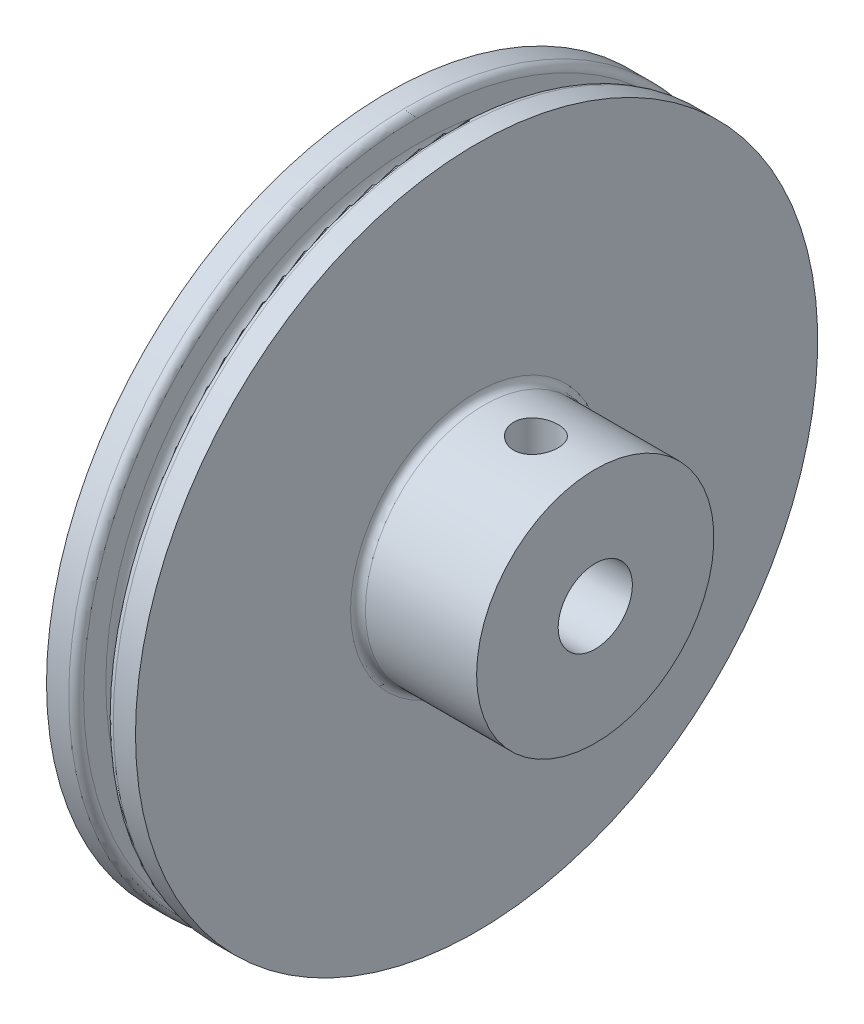
ISO-10303-21;
HEADER;
FILE_DESCRIPTION(('STEP AP214'),'2;1');
FILE_NAME('part.step','',(''),(''),'','','');
FILE_SCHEMA(('AUTOMOTIVE_DESIGN { 1 0 10303 214 1 1 1 1 }'));
ENDSEC;
DATA;
#1=APPLICATION_CONTEXT('core data for automotive mechanical design processes');
#2=APPLICATION_PROTOCOL_DEFINITION('international standard','automotive_design',2000,#1);
#3=PRODUCT_CONTEXT('',#1,'mechanical');
#4=PRODUCT('Part','Part','',(#3));
#5=PRODUCT_RELATED_PRODUCT_CATEGORY('part','',(#4));
#6=PRODUCT_DEFINITION_FORMATION('','',#4);
#7=PRODUCT_DEFINITION_CONTEXT('part definition',#1,'design');
#8=PRODUCT_DEFINITION('design','',#6,#7);
#9=PRODUCT_DEFINITION_SHAPE('','',#8);
#10=(LENGTH_UNIT() NAMED_UNIT(*) SI_UNIT(.MILLI.,.METRE.));
#11=(NAMED_UNIT(*) PLANE_ANGLE_UNIT() SI_UNIT($,.RADIAN.));
#12=(NAMED_UNIT(*) SI_UNIT($,.STERADIAN.) SOLID_ANGLE_UNIT());
#13=UNCERTAINTY_MEASURE_WITH_UNIT(LENGTH_MEASURE(1.E-05),#10,'distance_accuracy_value','');
#14=(GEOMETRIC_REPRESENTATION_CONTEXT(3) GLOBAL_UNCERTAINTY_ASSIGNED_CONTEXT((#13)) GLOBAL_UNIT_ASSIGNED_CONTEXT((#10,
#11,#12)) REPRESENTATION_CONTEXT('',''));
#15=CARTESIAN_POINT('',(0.,0.,0.));
#16=DIRECTION('',(0.,0.,1.));
#17=DIRECTION('',(1.,0.,0.));
#18=AXIS2_PLACEMENT_3D('',#15,#16,#17);
#19=CARTESIAN_POINT('',(-11.5426807899439,-7.97709760738326,0.));
#20=DIRECTION('',(-1.,0.,0.));
#21=DIRECTION('',(0.,0.,1.));
#22=AXIS2_PLACEMENT_3D('',#19,#20,#21);
#23=CYLINDRICAL_SURFACE('',#22,8.);
#24=CARTESIAN_POINT('',(2.45731921005608,-7.97709760738326,0.));
#25=DIRECTION('',(-1.,0.,0.));
#26=DIRECTION('',(0.,0.,1.));
#27=AXIS2_PLACEMENT_3D('',#24,#25,#26);
#28=CIRCLE('',#27,8.);
#29=CARTESIAN_POINT('',(2.45731921005608,-7.97709760738326,8.));
#30=VERTEX_POINT('',#29);
#31=EDGE_CURVE('E73',#30,#30,#28,.T.);
#32=ORIENTED_EDGE('',*,*,#31,.T.);
#33=EDGE_LOOP('',(#32));
#34=FACE_BOUND('',#33,.T.);
#35=CARTESIAN_POINT('',(-5.04268078994391,-7.97709760738326,0.));
#36=DIRECTION('',(-1.,0.,0.));
#37=DIRECTION('',(0.,0.,1.));
#38=AXIS2_PLACEMENT_3D('',#35,#36,#37);
#39=CIRCLE('',#38,8.);
#40=CARTESIAN_POINT('',(-5.04268078994391,-7.97709760738326,8.));
#41=VERTEX_POINT('',#40);
#42=EDGE_CURVE('E70',#41,#41,#39,.T.);
#43=ORIENTED_EDGE('',*,*,#42,.F.);
#44=EDGE_LOOP('',(#43));
#45=FACE_BOUND('',#44,.T.);
#46=CARTESIAN_POINT('',(-1.54268078994392,-0.1189807846324,-1.5));
#47=CARTESIAN_POINT('',(-1.62613799795566,-0.118979169448321,-1.49999679883246));
#48=CARTESIAN_POINT('',(-1.70963673816231,-0.117636809780593,-1.49301126348936));
#49=CARTESIAN_POINT('',(-1.87427975152583,-0.112419097239615,-1.46527253251805));
#50=CARTESIAN_POINT('',(-1.9554219663714,-0.108541595651204,-1.44450765768477));
#51=CARTESIAN_POINT('',(-2.11294586131479,-0.0987078427344111,-1.38987035617788));
#52=CARTESIAN_POINT('',(-2.18933189925121,-0.0927535283232876,-1.35601013954374));
#53=CARTESIAN_POINT('',(-2.33533434923073,-0.0794393441736656,-1.27617565760366));
#54=CARTESIAN_POINT('',(-2.40495128894722,-0.0720795841270393,-1.23020233759193));
#55=CARTESIAN_POINT('',(-2.53631098914305,-0.0566814589938103,-1.12683678942622));
#56=CARTESIAN_POINT('',(-2.59795727341565,-0.0486364411264648,-1.06932292933092));
#57=CARTESIAN_POINT('',(-2.71078517954348,-0.0328330307429168,-0.944771778803551));
#58=CARTESIAN_POINT('',(-2.76196611436871,-0.025074657071728,-0.877733863624944));
#59=CARTESIAN_POINT('',(-2.85278016654443,-0.010647429099206,-0.735403894570162));
#60=CARTESIAN_POINT('',(-2.89232232346334,-0.0039873268596266,-0.660052840033865));
#61=CARTESIAN_POINT('',(-2.95815033221745,0.0074184789460498,-0.503631283250762));
#62=CARTESIAN_POINT('',(-2.98443727393414,0.012164339900085,-0.422561251859505));
#63=CARTESIAN_POINT('',(-3.02271033855505,0.0191599438545286,-0.258002746187416));
#64=CARTESIAN_POINT('',(-3.0348590958666,0.0214380523800125,-0.174553323244857));
#65=CARTESIAN_POINT('',(-3.04501767764432,0.0233392387726849,-0.00677167603538295));
#66=CARTESIAN_POINT('',(-3.04302870608297,0.0229625427237117,0.0775604724476703));
#67=CARTESIAN_POINT('',(-3.02509301879677,0.019618730249157,0.243598357899397));
#68=CARTESIAN_POINT('',(-3.00932142051391,0.0166841150888811,0.325323760451469));
#69=CARTESIAN_POINT('',(-2.96454514054868,0.0085906559523551,0.484947165715476));
#70=CARTESIAN_POINT('',(-2.93553997659811,0.00343173091639956,0.562845028826541));
#71=CARTESIAN_POINT('',(-2.86495305888562,-0.00858500440986463,0.713110065751521));
#72=CARTESIAN_POINT('',(-2.82330130203142,-0.0154522314750013,0.785443571838533));
#73=CARTESIAN_POINT('',(-2.72865512086676,-0.030126131954757,0.922159977214638));
#74=CARTESIAN_POINT('',(-2.67565954305634,-0.0379329008716158,0.986542066910785));
#75=CARTESIAN_POINT('',(-2.55886508696039,-0.0537624705775899,1.10656561896904));
#76=CARTESIAN_POINT('',(-2.49491300604184,-0.0617867483670413,1.16205790757041));
#77=CARTESIAN_POINT('',(-2.35853125866529,-0.07703251813705,1.2615517185126));
#78=CARTESIAN_POINT('',(-2.28610146817928,-0.0842539983697489,1.30555307271182));
#79=CARTESIAN_POINT('',(-2.13462251924126,-0.0970786743120412,1.38085852224478));
#80=CARTESIAN_POINT('',(-2.05556233275327,-0.102679102080645,1.41214093645421));
#81=CARTESIAN_POINT('',(-1.89317960582072,-0.111585183416364,1.46093656975056));
#82=CARTESIAN_POINT('',(-1.80985754947913,-0.114891096997061,1.47845134901108));
#83=CARTESIAN_POINT('',(-1.64266146108804,-0.118782404373203,1.49899672649739));
#84=CARTESIAN_POINT('',(-1.5588146743784,-0.119408049221891,1.50224164285859));
#85=CARTESIAN_POINT('',(-1.39177733485677,-0.117975693174853,1.49472968881724));
#86=CARTESIAN_POINT('',(-1.30858674979583,-0.115917824997143,1.48397351086433));
#87=CARTESIAN_POINT('',(-1.14592788688953,-0.109387806751202,1.44894868195883));
#88=CARTESIAN_POINT('',(-1.06643453731902,-0.104935740474469,1.4247923858399));
#89=CARTESIAN_POINT('',(-0.91262360021376,-0.0941362658170685,1.3637722437906));
#90=CARTESIAN_POINT('',(-0.838306394628586,-0.0877887177504444,1.32690746128795));
#91=CARTESIAN_POINT('',(-0.696013170900749,-0.0738218287464044,1.2410235311966));
#92=CARTESIAN_POINT('',(-0.628120252077844,-0.0661886531301031,1.19186899639621));
#93=CARTESIAN_POINT('',(-0.501468749729585,-0.0505494937022523,1.08298344344247));
#94=CARTESIAN_POINT('',(-0.442710988388144,-0.0425434764183196,1.02325147433084));
#95=CARTESIAN_POINT('',(-0.335197026409792,-0.0269313673237975,0.893949417870385));
#96=CARTESIAN_POINT('',(-0.286584963337952,-0.0193320490502059,0.82425853409589));
#97=CARTESIAN_POINT('',(-0.201759583766254,-0.0055035592797496,0.677574523040139));
#98=CARTESIAN_POINT('',(-0.165545789918912,0.000725664963992805,0.600581677038528));
#99=CARTESIAN_POINT('',(-0.106760692079837,0.0110829725752218,0.441877541578683));
#100=CARTESIAN_POINT('',(-0.0841186023825082,0.0152219399181671,0.360193213078987));
#101=CARTESIAN_POINT('',(-0.052893741654032,0.020978813454195,0.19409622738157));
#102=CARTESIAN_POINT('',(-0.0443094912812086,0.0225969849160743,0.10968385821585));
#103=CARTESIAN_POINT('',(-0.0414954884254764,0.0231246677711521,-0.05809076025051));
#104=CARTESIAN_POINT('',(-0.0470480368143909,0.022075258867063,-0.141449307066269));
#105=CARTESIAN_POINT('',(-0.0718732177123534,0.0174710587337709,-0.3060233692792));
#106=CARTESIAN_POINT('',(-0.0911457186881286,0.0139162915234572,-0.38723890521369));
#107=CARTESIAN_POINT('',(-0.142771997327635,0.00470077239719345,-0.545106475595485));
#108=CARTESIAN_POINT('',(-0.175102602824925,-0.00095624756749898,-0.621766319318224));
#109=CARTESIAN_POINT('',(-0.251901243599101,-0.0137638866955471,-0.768605631316695));
#110=CARTESIAN_POINT('',(-0.296370092050572,-0.0209146059184257,-0.838784665003271));
#111=CARTESIAN_POINT('',(-0.39693224438624,-0.0360498087838449,-0.971755027780007));
#112=CARTESIAN_POINT('',(-0.453182823805624,-0.044044761470537,-1.03442623539053));
#113=CARTESIAN_POINT('',(-0.575385352436625,-0.0599012719949244,-1.14951536065485));
#114=CARTESIAN_POINT('',(-0.641339580317638,-0.0677627980156094,-1.2019308632478));
#115=CARTESIAN_POINT('',(-0.781807244647263,-0.0825418331239993,-1.29547633945385));
#116=CARTESIAN_POINT('',(-0.856394229611557,-0.0894499345759686,-1.33649740531872));
#117=CARTESIAN_POINT('',(-1.01150657992366,-0.101426760882926,-1.40536132423417));
#118=CARTESIAN_POINT('',(-1.0920262565333,-0.106497220892092,-1.43321661638912));
#119=CARTESIAN_POINT('',(-1.23443307800983,-0.113167444462008,-1.46929726596175));
#120=CARTESIAN_POINT('',(-1.29548651370586,-0.115334500203935,-1.4807910573985));
#121=CARTESIAN_POINT('',(-1.41857925836423,-0.118241751428211,-1.49614351076215));
#122=CARTESIAN_POINT('',(-1.48061854044424,-0.118981985750431,-1.50000238052127));
#123=CARTESIAN_POINT('',(-1.54268078994392,-0.1189807846324,-1.5));
#124=B_SPLINE_CURVE_WITH_KNOTS('',3,(#46,#47,#48,#49,#50,#51,#52,#53,#54,#55,#56,#57,#58,#59,
#60,#61,#62,#63,#64,#65,#66,#67,#68,#69,#70,#71,#72,#73,#74,#75,#76,#77,#78,#79,#80,#81,#82,#83,
#84,#85,#86,#87,#88,#89,#90,#91,#92,#93,#94,#95,#96,#97,#98,#99,#100,#101,#102,#103,#104,#105,
#106,#107,#108,#109,#110,#111,#112,#113,#114,#115,#116,#117,#118,#119,#120,#121,#122,#123),
.UNSPECIFIED.,.T.,.F.,(4,2,2,2,2,2,2,2,2,2,2,2,2,2,2,2,2,2,2,2,2,2,2,2,2,2,2,2,2,2,2,2,2,2,2,2,
2,2,4),(0.,0.250144505793186,0.500501302380393,0.750625227978432,1.00072963993908,
1.25362335698691,1.50653367069315,1.76137104348047,2.0161874593964,2.26804275460261,
2.51987660200648,2.76855650598725,3.01724547328425,3.26733691984219,3.51745380911785,
3.77140614764064,4.025362201924,4.27974936118266,4.53410768866488,4.78463248587075,
5.03514489338718,5.28358792315368,5.53204926624317,5.78337862654143,6.03473059394677,
6.28944125495871,6.54414210821705,6.79750269418683,7.0508366166733,7.30029300570138,
7.54974700322167,7.79876026530358,8.0477902135711,8.30038464008745,8.55303847730765,
8.80803001818118,9.06278015749119,9.24880307527214,9.43482092920425),.UNSPECIFIED.);
#125=CARTESIAN_POINT('',(-1.54268078994392,-0.1189807846324,-1.5));
#126=VERTEX_POINT('',#125);
#127=EDGE_CURVE('E82',#126,#126,#124,.T.);
#128=ORIENTED_EDGE('',*,*,#127,.F.);
#129=EDGE_LOOP('',(#128));
#130=FACE_BOUND('',#129,.T.);
#131=ADVANCED_FACE('F31',(#34,#45,#130),#23,.T.);
#132=CARTESIAN_POINT('',(-11.5426807899439,-7.97709760738326,0.));
#133=DIRECTION('',(-1.,0.,0.));
#134=DIRECTION('',(0.,0.,1.));
#135=AXIS2_PLACEMENT_3D('',#132,#133,#134);
#136=CYLINDRICAL_SURFACE('',#135,2.5);
#137=CARTESIAN_POINT('',(-11.5426807899439,-7.97709760738326,0.));
#138=DIRECTION('',(-1.,0.,0.));
#139=DIRECTION('',(0.,0.,1.));
#140=AXIS2_PLACEMENT_3D('',#137,#138,#139);
#141=CIRCLE('',#140,2.5);
#142=CARTESIAN_POINT('',(-11.5426807899439,-7.97709760738326,2.5));
#143=VERTEX_POINT('',#142);
#144=EDGE_CURVE('E79',#143,#143,#141,.T.);
#145=ORIENTED_EDGE('',*,*,#144,.T.);
#146=EDGE_LOOP('',(#145));
#147=FACE_BOUND('',#146,.T.);
#148=CARTESIAN_POINT('',(2.45731921005608,-7.97709760738326,0.));
#149=DIRECTION('',(-1.,0.,0.));
#150=DIRECTION('',(0.,0.,1.));
#151=AXIS2_PLACEMENT_3D('',#148,#149,#150);
#152=CIRCLE('',#151,2.5);
#153=CARTESIAN_POINT('',(2.45731921005608,-7.97709760738326,2.5));
#154=VERTEX_POINT('',#153);
#155=EDGE_CURVE('E76',#154,#154,#152,.T.);
#156=ORIENTED_EDGE('',*,*,#155,.F.);
#157=EDGE_LOOP('',(#156));
#158=FACE_BOUND('',#157,.T.);
#159=CARTESIAN_POINT('',(-1.54268078994392,-5.97709760738325,-1.5));
#160=CARTESIAN_POINT('',(-1.46720181465428,-5.97710344095814,-1.50000404108592));
#161=CARTESIAN_POINT('',(-1.39174235586412,-5.97276126834844,-1.49426852824013));
#162=CARTESIAN_POINT('',(-1.2433568859817,-5.95617170124443,-1.47174965152787));
#163=CARTESIAN_POINT('',(-1.17043360255882,-5.94391605695228,-1.45495475788936));
#164=CARTESIAN_POINT('',(-1.02959714826664,-5.91347421703596,-1.41143486335795));
#165=CARTESIAN_POINT('',(-0.961651951908651,-5.89533094555206,-1.3847815450315));
#166=CARTESIAN_POINT('',(-0.831243336575999,-5.8552385574249,-1.32252909283019));
#167=CARTESIAN_POINT('',(-0.76878156024878,-5.8332883061591,-1.28692729054693));
#168=CARTESIAN_POINT('',(-0.642731773279836,-5.78481166150783,-1.20271292747644));
#169=CARTESIAN_POINT('',(-0.579939832819976,-5.75805389700663,-1.15304179435289));
#170=CARTESIAN_POINT('',(-0.462916027202164,-5.70483531307265,-1.04426801309985));
#171=CARTESIAN_POINT('',(-0.408690638273116,-5.67837473221223,-0.985158296729613));
#172=CARTESIAN_POINT('',(-0.304546980234223,-5.62534192879592,-0.851442367411701));
#173=CARTESIAN_POINT('',(-0.255726326274167,-5.59906627160508,-0.775851995162548));
#174=CARTESIAN_POINT('',(-0.171871067499486,-5.55265973755146,-0.615654228271658));
#175=CARTESIAN_POINT('',(-0.136823815821204,-5.53252322749591,-0.531055196626331));
#176=CARTESIAN_POINT('',(-0.0850848671312704,-5.50238772937885,-0.363771406742667));
#177=CARTESIAN_POINT('',(-0.0669604289766213,-5.49160456799156,-0.281674698130916));
#178=CARTESIAN_POINT('',(-0.0447379870807973,-5.4783482146078,-0.114970509382709));
#179=CARTESIAN_POINT('',(-0.0406268119438634,-5.47586721925018,-0.0303654624001541));
#180=CARTESIAN_POINT('',(-0.0462945372863787,-5.47926388026787,0.127637283737309));
#181=CARTESIAN_POINT('',(-0.0544143161132306,-5.48414323224599,0.201123832865634));
#182=CARTESIAN_POINT('',(-0.0811605855920249,-5.50001763184468,0.345464269151767));
#183=CARTESIAN_POINT('',(-0.0997878538510733,-5.51101313209017,0.416317961051201));
#184=CARTESIAN_POINT('',(-0.146846352647696,-5.53824853536606,0.554056780469079));
#185=CARTESIAN_POINT('',(-0.175333851082915,-5.55451850287502,0.620916491037617));
#186=CARTESIAN_POINT('',(-0.24106540616946,-5.59100123099577,0.74898866011561));
#187=CARTESIAN_POINT('',(-0.278311737002929,-5.61121501536514,0.810199646208011));
#188=CARTESIAN_POINT('',(-0.365519882748369,-5.65671834761963,0.933074267143199));
#189=CARTESIAN_POINT('',(-0.416469101679654,-5.68232577786176,0.993918663198193));
#190=CARTESIAN_POINT('',(-0.527084907804094,-5.73454206492724,1.10671465909275));
#191=CARTESIAN_POINT('',(-0.586763293418424,-5.7611522403495,1.1586540130834));
#192=CARTESIAN_POINT('',(-0.721334196107472,-5.8159868561438,1.25824837767417));
#193=CARTESIAN_POINT('',(-0.79718836648338,-5.84404099353201,1.30470933188632));
#194=CARTESIAN_POINT('',(-0.957387021580526,-5.89458881181058,1.38397217194232));
#195=CARTESIAN_POINT('',(-1.04171550606956,-5.91709270439505,1.41679921962189));
#196=CARTESIAN_POINT('',(-1.19507442183927,-5.94813895541594,1.46077497064842));
#197=CARTESIAN_POINT('',(-1.26272142224056,-5.9587587212001,1.47527903312665));
#198=CARTESIAN_POINT('',(-1.4000544002434,-5.97317609960767,1.49480872755284));
#199=CARTESIAN_POINT('',(-1.46973791042848,-5.97698164623209,1.49984538302907));
#200=CARTESIAN_POINT('',(-1.60923247237962,-5.97720846417003,1.50014781114183));
#201=CARTESIAN_POINT('',(-1.67904356715913,-5.97361950514341,1.49540004697659));
#202=CARTESIAN_POINT('',(-1.81666813369248,-5.95958239949673,1.47640290574941));
#203=CARTESIAN_POINT('',(-1.88447998218417,-5.94912883125113,1.46214601830139));
#204=CARTESIAN_POINT('',(-2.0163953694237,-5.92277992405225,1.42488312618657));
#205=CARTESIAN_POINT('',(-2.08050342647615,-5.90689138645514,1.40188805257362));
#206=CARTESIAN_POINT('',(-2.2041585056741,-5.87138221320739,1.34796261057072));
#207=CARTESIAN_POINT('',(-2.26370379630992,-5.85176017048327,1.31702924888212));
#208=CARTESIAN_POINT('',(-2.38792087245616,-5.80672941560589,1.24167439558512));
#209=CARTESIAN_POINT('',(-2.45158162504049,-5.78091521340957,1.19582663060303));
#210=CARTESIAN_POINT('',(-2.57096627479338,-5.72888005934705,1.09487395518701));
#211=CARTESIAN_POINT('',(-2.62668248211303,-5.70265874026871,1.03976018672402));
#212=CARTESIAN_POINT('',(-2.73590479729435,-5.64874134827412,0.913274837212767));
#213=CARTESIAN_POINT('',(-2.78818151654975,-5.62129684862456,0.840721108780192));
#214=CARTESIAN_POINT('',(-2.87958356678057,-5.57172121604867,0.686103100868021));
#215=CARTESIAN_POINT('',(-2.91871761778484,-5.54958656288915,0.604045176134704));
#216=CARTESIAN_POINT('',(-2.97954899337528,-5.51457480645551,0.438840232972139));
#217=CARTESIAN_POINT('',(-3.00230701773502,-5.50114172670997,0.356205963651259));
#218=CARTESIAN_POINT('',(-3.03339539279018,-5.48269021832226,0.187383063890858));
#219=CARTESIAN_POINT('',(-3.04174208066154,-5.47766226155588,0.10119857178197));
#220=CARTESIAN_POINT('',(-3.04335539852984,-5.4766916027635,-0.0598120232009827));
#221=CARTESIAN_POINT('',(-3.03848412450695,-5.47962703551999,-0.134620583589705));
#222=CARTESIAN_POINT('',(-3.0177869655623,-5.4919681232623,-0.282148755978772));
#223=CARTESIAN_POINT('',(-3.00196095862232,-5.50137385031686,-0.354868344701913));
#224=CARTESIAN_POINT('',(-2.96046121836013,-5.52560333211364,-0.495145481978796));
#225=CARTESIAN_POINT('',(-2.93494919381467,-5.54033793879419,-0.562767032608829));
#226=CARTESIAN_POINT('',(-2.87504019538917,-5.57406423291171,-0.692781971999983));
#227=CARTESIAN_POINT('',(-2.84064122908432,-5.59305687486058,-0.755174184199831));
#228=CARTESIAN_POINT('',(-2.75975559337516,-5.63616328078945,-0.880263645295946));
#229=CARTESIAN_POINT('',(-2.71236208092705,-5.66060916099176,-0.942258690439938));
#230=CARTESIAN_POINT('',(-2.60892775622619,-5.71107853387664,-1.05789751536306));
#231=CARTESIAN_POINT('',(-2.55287736433601,-5.73710375463817,-1.11153190956916));
#232=CARTESIAN_POINT('',(-2.42539522776622,-5.79181595072121,-1.2159097535057));
#233=CARTESIAN_POINT('',(-2.35291430377842,-5.82042194467425,-1.26542406663367));
#234=CARTESIAN_POINT('',(-2.19919593717738,-5.8733329625318,-1.35156817210325));
#235=CARTESIAN_POINT('',(-2.1179630759625,-5.89764021927273,-1.38820466322661));
#236=CARTESIAN_POINT('',(-1.95561650480672,-5.93629757690365,-1.44437116535132));
#237=CARTESIAN_POINT('',(-1.87508555398267,-5.95132094908187,-1.46509526060187));
#238=CARTESIAN_POINT('',(-1.71058339524024,-5.97170728418289,-1.49289268240426));
#239=CARTESIAN_POINT('',(-1.62662002418521,-5.97709111993682,-1.49999550595837));
#240=CARTESIAN_POINT('',(-1.54268078994392,-5.97709760738325,-1.5));
#241=B_SPLINE_CURVE_WITH_KNOTS('',3,(#159,#160,#161,#162,#163,#164,#165,#166,#167,#168,#169,
#170,#171,#172,#173,#174,#175,#176,#177,#178,#179,#180,#181,#182,#183,#184,#185,#186,#187,#188,
#189,#190,#191,#192,#193,#194,#195,#196,#197,#198,#199,#200,#201,#202,#203,#204,#205,#206,#207,
#208,#209,#210,#211,#212,#213,#214,#215,#216,#217,#218,#219,#220,#221,#222,#223,#224,#225,#226,
#227,#228,#229,#230,#231,#232,#233,#234,#235,#236,#237,#238,#239,#240),.UNSPECIFIED.,.T.,.F.,(4,
2,2,2,2,2,2,2,2,2,2,2,2,2,2,2,2,2,2,2,2,2,2,2,2,2,2,2,2,2,2,2,2,2,2,2,2,2,2,2,4),(0.,
0.226085249493392,0.45240657433077,0.677113624991876,0.901887762215932,1.15414462390001,
1.40659128601844,1.68630157736223,1.9657544327122,2.21853330858497,2.47107452602766,
2.69230130543181,2.91354445887944,3.13607155036376,3.35865648368878,3.60782810055849,
3.85733966656908,4.13576671140276,4.41367760154768,4.62276298054684,4.83160475643976,
5.04073566011181,5.25003193304127,5.45906724365495,5.6681814915466,5.91499438482002,
6.16204457978454,6.44121828011588,6.72020638384847,6.97891479383337,7.23732973022726,
7.46129321849399,7.68525920139647,7.90563970188756,8.12606965394584,8.37042963549486,
8.61506198741954,8.89071695766603,9.16622832484805,9.41820120134353,9.66962780912277),.UNSPECIFIED.);
#242=CARTESIAN_POINT('',(-1.54268078994392,-5.97709760738325,-1.5));
#243=VERTEX_POINT('',#242);
#244=EDGE_CURVE('E35',#243,#243,#241,.T.);
#245=ORIENTED_EDGE('',*,*,#244,.F.);
#246=EDGE_LOOP('',(#245));
#247=FACE_BOUND('',#246,.T.);
#248=ADVANCED_FACE('F95',(#147,#158,#247),#136,.F.);
#249=CARTESIAN_POINT('',(-11.5426807899439,15.0229023926167,0.));
#250=DIRECTION('',(1.,0.,0.));
#251=DIRECTION('',(0.,0.,-1.));
#252=AXIS2_PLACEMENT_3D('',#249,#250,#251);
#253=PLANE('',#252);
#254=ORIENTED_EDGE('',*,*,#144,.F.);
#255=EDGE_LOOP('',(#254));
#256=FACE_BOUND('',#255,.T.);
#257=CARTESIAN_POINT('',(-11.5426807899439,-7.97709760738326,0.));
#258=DIRECTION('',(-1.,0.,0.));
#259=DIRECTION('',(0.,0.,1.));
#260=AXIS2_PLACEMENT_3D('',#257,#258,#259);
#261=CIRCLE('',#260,23.);
#262=CARTESIAN_POINT('',(-11.5426807899439,-7.97709760738326,23.));
#263=VERTEX_POINT('',#262);
#264=EDGE_CURVE('E10',#263,#263,#261,.T.);
#265=ORIENTED_EDGE('',*,*,#264,.T.);
#266=EDGE_LOOP('',(#265));
#267=FACE_BOUND('',#266,.T.);
#268=ADVANCED_FACE('F33',(#256,#267),#253,.F.);
#269=CARTESIAN_POINT('',(-11.5426807899439,-7.97709760738326,0.));
#270=DIRECTION('',(-1.,0.,0.));
#271=DIRECTION('',(0.,0.,1.));
#272=AXIS2_PLACEMENT_3D('',#269,#270,#271);
#273=CYLINDRICAL_SURFACE('',#272,23.);
#274=ORIENTED_EDGE('',*,*,#264,.F.);
#275=EDGE_LOOP('',(#274));
#276=FACE_BOUND('',#275,.T.);
#277=CARTESIAN_POINT('',(-10.0426807899439,-7.97709760738326,0.));
#278=DIRECTION('',(-1.,0.,0.));
#279=DIRECTION('',(0.,0.,1.));
#280=AXIS2_PLACEMENT_3D('',#277,#278,#279);
#281=CIRCLE('',#280,23.);
#282=CARTESIAN_POINT('',(-10.0426807899439,-7.97709760738326,23.));
#283=VERTEX_POINT('',#282);
#284=EDGE_CURVE('E43',#283,#283,#281,.T.);
#285=ORIENTED_EDGE('',*,*,#284,.T.);
#286=EDGE_LOOP('',(#285));
#287=FACE_BOUND('',#286,.T.);
#288=ADVANCED_FACE('F131',(#276,#287),#273,.T.);
#289=CARTESIAN_POINT('',(-10.0426807899439,-7.97709760738326,0.));
#290=DIRECTION('',(-1.,0.,0.));
#291=DIRECTION('',(0.,0.,1.));
#292=AXIS2_PLACEMENT_3D('',#289,#290,#291);
#293=TOROIDAL_SURFACE('',#292,22.5,0.5);
#294=ORIENTED_EDGE('',*,*,#284,.F.);
#295=EDGE_LOOP('',(#294));
#296=FACE_BOUND('',#295,.T.);
#297=CARTESIAN_POINT('',(-9.54268078994392,-7.97709760738326,0.));
#298=DIRECTION('',(-1.,0.,0.));
#299=DIRECTION('',(0.,0.,1.));
#300=AXIS2_PLACEMENT_3D('',#297,#298,#299);
#301=CIRCLE('',#300,22.5);
#302=CARTESIAN_POINT('',(-9.54268078994392,-7.97709760738326,22.5));
#303=VERTEX_POINT('',#302);
#304=EDGE_CURVE('E47',#303,#303,#301,.T.);
#305=ORIENTED_EDGE('',*,*,#304,.T.);
#306=EDGE_LOOP('',(#305));
#307=FACE_BOUND('',#306,.T.);
#308=ADVANCED_FACE('F138',(#296,#307),#293,.T.);
#309=CARTESIAN_POINT('',(-9.54268078994392,14.5229023926167,0.));
#310=DIRECTION('',(-1.,0.,0.));
#311=DIRECTION('',(0.,0.,1.));
#312=AXIS2_PLACEMENT_3D('',#309,#310,#311);
#313=PLANE('',#312);
#314=ORIENTED_EDGE('',*,*,#304,.F.);
#315=EDGE_LOOP('',(#314));
#316=FACE_BOUND('',#315,.T.);
#317=CARTESIAN_POINT('',(-9.54268078994392,-7.97709760738326,0.));
#318=DIRECTION('',(-1.,0.,0.));
#319=DIRECTION('',(0.,0.,1.));
#320=AXIS2_PLACEMENT_3D('',#317,#318,#319);
#321=CIRCLE('',#320,21.0000000599991);
#322=CARTESIAN_POINT('',(-9.54268078994392,-7.97709760738326,21.0000000599991));
#323=VERTEX_POINT('',#322);
#324=EDGE_CURVE('E52',#323,#323,#321,.T.);
#325=ORIENTED_EDGE('',*,*,#324,.T.);
#326=EDGE_LOOP('',(#325));
#327=FACE_BOUND('',#326,.T.);
#328=ADVANCED_FACE('F145',(#316,#327),#313,.F.);
#329=CARTESIAN_POINT('',(-8.54268078994392,-7.97709760738326,0.));
#330=DIRECTION('',(-1.,0.,0.));
#331=DIRECTION('',(0.,0.,1.));
#332=AXIS2_PLACEMENT_3D('',#329,#330,#331);
#333=TOROIDAL_SURFACE('',#332,21.0000000599991,1.);
#334=ORIENTED_EDGE('',*,*,#324,.F.);
#335=EDGE_LOOP('',(#334));
#336=FACE_BOUND('',#335,.T.);
#337=CARTESIAN_POINT('',(-7.54268078994392,-7.97709760738326,0.));
#338=DIRECTION('',(-1.,0.,0.));
#339=DIRECTION('',(0.,0.,1.));
#340=AXIS2_PLACEMENT_3D('',#337,#338,#339);
#341=CIRCLE('',#340,21.0000000599991);
#342=CARTESIAN_POINT('',(-7.54268078994392,-7.97709760738326,21.0000000599991));
#343=VERTEX_POINT('',#342);
#344=EDGE_CURVE('E55',#343,#343,#341,.T.);
#345=ORIENTED_EDGE('',*,*,#344,.T.);
#346=EDGE_LOOP('',(#345));
#347=FACE_BOUND('',#346,.T.);
#348=ADVANCED_FACE('F153',(#336,#347),#333,.F.);
#349=CARTESIAN_POINT('',(-7.54268078994392,14.5229023926167,0.));
#350=DIRECTION('',(1.,0.,0.));
#351=DIRECTION('',(0.,0.,-1.));
#352=AXIS2_PLACEMENT_3D('',#349,#350,#351);
#353=PLANE('',#352);
#354=ORIENTED_EDGE('',*,*,#344,.F.);
#355=EDGE_LOOP('',(#354));
#356=FACE_BOUND('',#355,.T.);
#357=CARTESIAN_POINT('',(-7.54268078994392,-7.97709760738326,0.));
#358=DIRECTION('',(-1.,0.,0.));
#359=DIRECTION('',(0.,0.,1.));
#360=AXIS2_PLACEMENT_3D('',#357,#358,#359);
#361=CIRCLE('',#360,22.5);
#362=CARTESIAN_POINT('',(-7.54268078994392,-7.97709760738326,22.5));
#363=VERTEX_POINT('',#362);
#364=EDGE_CURVE('E58',#363,#363,#361,.T.);
#365=ORIENTED_EDGE('',*,*,#364,.T.);
#366=EDGE_LOOP('',(#365));
#367=FACE_BOUND('',#366,.T.);
#368=ADVANCED_FACE('F161',(#356,#367),#353,.F.);
#369=CARTESIAN_POINT('',(-7.04268078994392,-7.97709760738326,0.));
#370=DIRECTION('',(-1.,0.,0.));
#371=DIRECTION('',(0.,0.,1.));
#372=AXIS2_PLACEMENT_3D('',#369,#370,#371);
#373=TOROIDAL_SURFACE('',#372,22.5,0.5);
#374=ORIENTED_EDGE('',*,*,#364,.F.);
#375=EDGE_LOOP('',(#374));
#376=FACE_BOUND('',#375,.T.);
#377=CARTESIAN_POINT('',(-7.04268078994391,-7.97709760738326,0.));
#378=DIRECTION('',(-1.,0.,0.));
#379=DIRECTION('',(0.,0.,1.));
#380=AXIS2_PLACEMENT_3D('',#377,#378,#379);
#381=CIRCLE('',#380,23.);
#382=CARTESIAN_POINT('',(-7.04268078994391,-7.97709760738326,23.));
#383=VERTEX_POINT('',#382);
#384=EDGE_CURVE('E61',#383,#383,#381,.T.);
#385=ORIENTED_EDGE('',*,*,#384,.T.);
#386=EDGE_LOOP('',(#385));
#387=FACE_BOUND('',#386,.T.);
#388=ADVANCED_FACE('F169',(#376,#387),#373,.T.);
#389=CARTESIAN_POINT('',(-11.5426807899439,-7.97709760738326,0.));
#390=DIRECTION('',(-1.,0.,0.));
#391=DIRECTION('',(0.,0.,1.));
#392=AXIS2_PLACEMENT_3D('',#389,#390,#391);
#393=CYLINDRICAL_SURFACE('',#392,23.);
#394=ORIENTED_EDGE('',*,*,#384,.F.);
#395=EDGE_LOOP('',(#394));
#396=FACE_BOUND('',#395,.T.);
#397=CARTESIAN_POINT('',(-5.54268078994392,-7.97709760738326,0.));
#398=DIRECTION('',(-1.,0.,0.));
#399=DIRECTION('',(0.,0.,1.));
#400=AXIS2_PLACEMENT_3D('',#397,#398,#399);
#401=CIRCLE('',#400,23.);
#402=CARTESIAN_POINT('',(-5.54268078994392,-7.97709760738326,23.));
#403=VERTEX_POINT('',#402);
#404=EDGE_CURVE('E64',#403,#403,#401,.T.);
#405=ORIENTED_EDGE('',*,*,#404,.T.);
#406=EDGE_LOOP('',(#405));
#407=FACE_BOUND('',#406,.T.);
#408=ADVANCED_FACE('F177',(#396,#407),#393,.T.);
#409=CARTESIAN_POINT('',(-5.54268078994392,15.0229023926167,0.));
#410=DIRECTION('',(-1.,0.,0.));
#411=DIRECTION('',(0.,0.,1.));
#412=AXIS2_PLACEMENT_3D('',#409,#410,#411);
#413=PLANE('',#412);
#414=ORIENTED_EDGE('',*,*,#404,.F.);
#415=EDGE_LOOP('',(#414));
#416=FACE_BOUND('',#415,.T.);
#417=CARTESIAN_POINT('',(-5.54268078994392,-7.97709760738326,0.));
#418=DIRECTION('',(-1.,0.,0.));
#419=DIRECTION('',(0.,0.,1.));
#420=AXIS2_PLACEMENT_3D('',#417,#418,#419);
#421=CIRCLE('',#420,8.5);
#422=CARTESIAN_POINT('',(-5.54268078994392,-7.97709760738326,8.5));
#423=VERTEX_POINT('',#422);
#424=EDGE_CURVE('E67',#423,#423,#421,.T.);
#425=ORIENTED_EDGE('',*,*,#424,.T.);
#426=EDGE_LOOP('',(#425));
#427=FACE_BOUND('',#426,.T.);
#428=ADVANCED_FACE('F106',(#416,#427),#413,.F.);
#429=CARTESIAN_POINT('',(-5.04268078994392,-7.97709760738326,0.));
#430=DIRECTION('',(-1.,0.,0.));
#431=DIRECTION('',(0.,0.,1.));
#432=AXIS2_PLACEMENT_3D('',#429,#430,#431);
#433=TOROIDAL_SURFACE('',#432,8.5,0.5);
#434=ORIENTED_EDGE('',*,*,#424,.F.);
#435=EDGE_LOOP('',(#434));
#436=FACE_BOUND('',#435,.T.);
#437=ORIENTED_EDGE('',*,*,#42,.T.);
#438=EDGE_LOOP('',(#437));
#439=FACE_BOUND('',#438,.T.);
#440=ADVANCED_FACE('F101',(#436,#439),#433,.F.);
#441=CARTESIAN_POINT('',(2.45731921005608,-5.47709760738326,0.));
#442=DIRECTION('',(-1.,0.,0.));
#443=DIRECTION('',(0.,0.,1.));
#444=AXIS2_PLACEMENT_3D('',#441,#442,#443);
#445=PLANE('',#444);
#446=ORIENTED_EDGE('',*,*,#31,.F.);
#447=EDGE_LOOP('',(#446));
#448=FACE_BOUND('',#447,.T.);
#449=ORIENTED_EDGE('',*,*,#155,.T.);
#450=EDGE_LOOP('',(#449));
#451=FACE_BOUND('',#450,.T.);
#452=ADVANCED_FACE('F93',(#448,#451),#445,.F.);
#453=CARTESIAN_POINT('',(-1.54268078994392,2.,0.));
#454=DIRECTION('',(0.,-1.,0.));
#455=DIRECTION('',(0.,0.,-1.));
#456=AXIS2_PLACEMENT_3D('',#453,#454,#455);
#457=CYLINDRICAL_SURFACE('',#456,1.5);
#458=ORIENTED_EDGE('',*,*,#244,.T.);
#459=EDGE_LOOP('',(#458));
#460=FACE_BOUND('',#459,.T.);
#461=ORIENTED_EDGE('',*,*,#127,.T.);
#462=EDGE_LOOP('',(#461));
#463=FACE_BOUND('',#462,.T.);
#464=ADVANCED_FACE('F90',(#460,#463),#457,.F.);
#465=CLOSED_SHELL('',(#131,#248,#268,#288,#308,#328,#348,#368,#388,#408,#428,#440,#452,#464));
#466=MANIFOLD_SOLID_BREP('B2',#465);
#467=ADVANCED_BREP_SHAPE_REPRESENTATION('',(#18,#466),#14);
#468=SHAPE_DEFINITION_REPRESENTATION(#9,#467);
ENDSEC;
END-ISO-10303-21;
